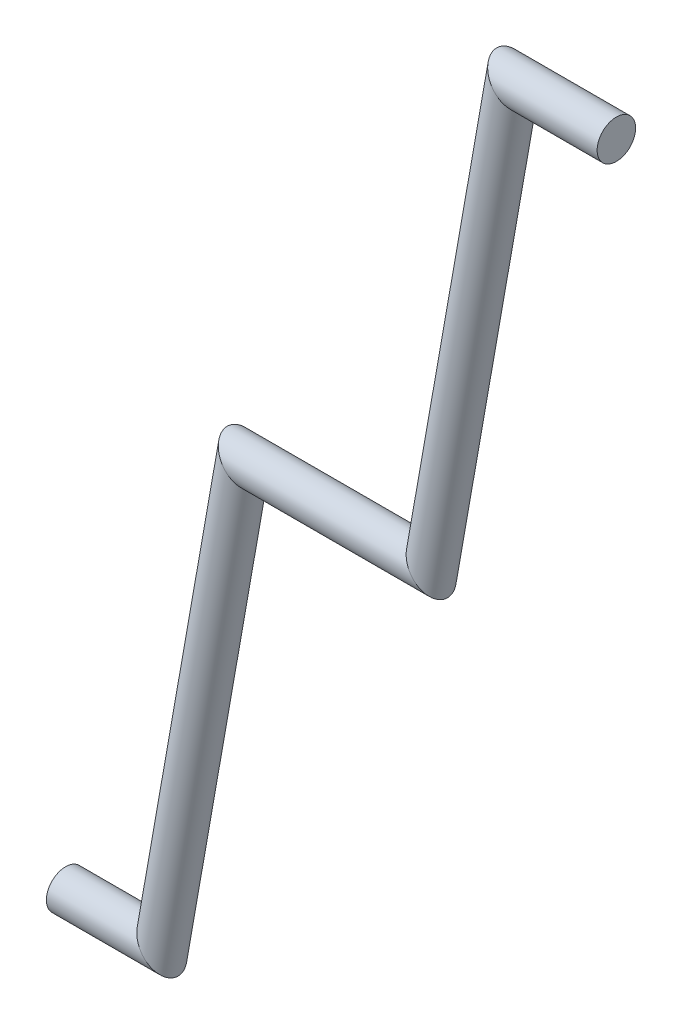
ISO-10303-21;
HEADER;
FILE_DESCRIPTION(('STEP AP214'),'2;1');
FILE_NAME('part.step','',(''),(''),'','','');
FILE_SCHEMA(('AUTOMOTIVE_DESIGN { 1 0 10303 214 1 1 1 1 }'));
ENDSEC;
DATA;
#1=APPLICATION_CONTEXT('core data for automotive mechanical design processes');
#2=APPLICATION_PROTOCOL_DEFINITION('international standard','automotive_design',2000,#1);
#3=PRODUCT_CONTEXT('',#1,'mechanical');
#4=PRODUCT('Part','Part','',(#3));
#5=PRODUCT_RELATED_PRODUCT_CATEGORY('part','',(#4));
#6=PRODUCT_DEFINITION_FORMATION('','',#4);
#7=PRODUCT_DEFINITION_CONTEXT('part definition',#1,'design');
#8=PRODUCT_DEFINITION('design','',#6,#7);
#9=PRODUCT_DEFINITION_SHAPE('','',#8);
#10=(LENGTH_UNIT() NAMED_UNIT(*) SI_UNIT(.MILLI.,.METRE.));
#11=(NAMED_UNIT(*) PLANE_ANGLE_UNIT() SI_UNIT($,.RADIAN.));
#12=(NAMED_UNIT(*) SI_UNIT($,.STERADIAN.) SOLID_ANGLE_UNIT());
#13=UNCERTAINTY_MEASURE_WITH_UNIT(LENGTH_MEASURE(1.E-05),#10,'distance_accuracy_value','');
#14=(GEOMETRIC_REPRESENTATION_CONTEXT(3) GLOBAL_UNCERTAINTY_ASSIGNED_CONTEXT((#13)) GLOBAL_UNIT_ASSIGNED_CONTEXT((#10,
#11,#12)) REPRESENTATION_CONTEXT('',''));
#15=CARTESIAN_POINT('',(0.,0.,0.));
#16=DIRECTION('',(0.,0.,1.));
#17=DIRECTION('',(1.,0.,0.));
#18=AXIS2_PLACEMENT_3D('',#15,#16,#17);
#19=CARTESIAN_POINT('',(147.421240327859,304.8,0.));
#20=DIRECTION('',(1.,0.,0.));
#21=DIRECTION('',(0.,1.,0.));
#22=AXIS2_PLACEMENT_3D('',#19,#20,#21);
#23=CYLINDRICAL_SURFACE('',#22,6.35);
#24=CARTESIAN_POINT('',(147.421240327859,304.8,0.));
#25=DIRECTION('',(0.766044443118977,0.64278760968654,0.));
#26=DIRECTION('',(-0.64278760968654,0.766044443118977,0.));
#27=AXIS2_PLACEMENT_3D('',#24,#25,#26);
#28=ELLIPSE('',#27,8.28933628725999,6.35);
#29=CARTESIAN_POINT('',(142.092957669884,311.15,0.));
#30=VERTEX_POINT('',#29);
#31=EDGE_CURVE('E42',#30,#30,#28,.T.);
#32=ORIENTED_EDGE('',*,*,#31,.T.);
#33=EDGE_LOOP('',(#32));
#34=FACE_BOUND('',#33,.T.);
#35=CARTESIAN_POINT('',(181.551345013433,304.8,0.));
#36=DIRECTION('',(1.,0.,0.));
#37=DIRECTION('',(0.,1.,0.));
#38=AXIS2_PLACEMENT_3D('',#35,#36,#37);
#39=CIRCLE('',#38,6.35);
#40=CARTESIAN_POINT('',(181.551345013433,311.15,0.));
#41=VERTEX_POINT('',#40);
#42=EDGE_CURVE('E11',#41,#41,#39,.F.);
#43=ORIENTED_EDGE('',*,*,#42,.T.);
#44=EDGE_LOOP('',(#43));
#45=FACE_BOUND('',#44,.T.);
#46=ADVANCED_FACE('F36',(#34,#45),#23,.T.);
#47=CARTESIAN_POINT('',(120.54900846789,152.4,0.));
#48=DIRECTION('',(0.173648177666927,0.984807753012209,0.));
#49=DIRECTION('',(-0.984807753012209,0.173648177666927,0.));
#50=AXIS2_PLACEMENT_3D('',#47,#48,#49);
#51=CYLINDRICAL_SURFACE('',#50,6.35);
#52=CARTESIAN_POINT('',(120.54900846789,152.4,0.));
#53=DIRECTION('',(0.766044443118977,0.642787609686541,0.));
#54=DIRECTION('',(0.642787609686541,-0.766044443118977,0.));
#55=AXIS2_PLACEMENT_3D('',#52,#53,#54);
#56=ELLIPSE('',#55,8.28933628725998,6.35);
#57=CARTESIAN_POINT('',(125.877291125866,146.05,0.));
#58=VERTEX_POINT('',#57);
#59=EDGE_CURVE('E46',#58,#58,#56,.F.);
#60=ORIENTED_EDGE('',*,*,#59,.F.);
#61=EDGE_LOOP('',(#60));
#62=FACE_BOUND('',#61,.T.);
#63=ORIENTED_EDGE('',*,*,#31,.F.);
#64=EDGE_LOOP('',(#63));
#65=FACE_BOUND('',#64,.T.);
#66=ADVANCED_FACE('F78',(#62,#65),#51,.T.);
#67=CARTESIAN_POINT('',(58.6222318599695,152.4,0.));
#68=DIRECTION('',(1.,0.,0.));
#69=DIRECTION('',(0.,1.,0.));
#70=AXIS2_PLACEMENT_3D('',#67,#68,#69);
#71=CYLINDRICAL_SURFACE('',#70,6.35);
#72=CARTESIAN_POINT('',(58.6222318599695,152.4,0.));
#73=DIRECTION('',(0.766044443118976,0.642787609686541,0.));
#74=DIRECTION('',(-0.642787609686541,0.766044443118976,0.));
#75=AXIS2_PLACEMENT_3D('',#72,#73,#74);
#76=ELLIPSE('',#75,8.28933628725998,6.35);
#77=CARTESIAN_POINT('',(53.2939492019937,158.75,0.));
#78=VERTEX_POINT('',#77);
#79=EDGE_CURVE('E50',#78,#78,#76,.F.);
#80=ORIENTED_EDGE('',*,*,#79,.F.);
#81=EDGE_LOOP('',(#80));
#82=FACE_BOUND('',#81,.T.);
#83=ORIENTED_EDGE('',*,*,#59,.T.);
#84=EDGE_LOOP('',(#83));
#85=FACE_BOUND('',#84,.T.);
#86=ADVANCED_FACE('F82',(#82,#85),#71,.T.);
#87=CARTESIAN_POINT('',(31.75,0.,0.));
#88=DIRECTION('',(0.173648177666927,0.984807753012209,0.));
#89=DIRECTION('',(-0.984807753012209,0.173648177666927,0.));
#90=AXIS2_PLACEMENT_3D('',#87,#88,#89);
#91=CYLINDRICAL_SURFACE('',#90,6.35);
#92=CARTESIAN_POINT('',(31.75,0.,0.));
#93=DIRECTION('',(0.766044443118977,0.642787609686541,0.));
#94=DIRECTION('',(-0.642787609686541,0.766044443118977,0.));
#95=AXIS2_PLACEMENT_3D('',#92,#93,#94);
#96=ELLIPSE('',#95,8.28933628725998,6.35);
#97=CARTESIAN_POINT('',(26.4217173420243,6.35,0.));
#98=VERTEX_POINT('',#97);
#99=EDGE_CURVE('E55',#98,#98,#96,.T.);
#100=ORIENTED_EDGE('',*,*,#99,.T.);
#101=EDGE_LOOP('',(#100));
#102=FACE_BOUND('',#101,.T.);
#103=ORIENTED_EDGE('',*,*,#79,.T.);
#104=EDGE_LOOP('',(#103));
#105=FACE_BOUND('',#104,.T.);
#106=ADVANCED_FACE('F75',(#102,#105),#91,.T.);
#107=CARTESIAN_POINT('',(49.7105122421383,0.,0.));
#108=DIRECTION('',(-1.,0.,0.));
#109=DIRECTION('',(0.,0.,1.));
#110=AXIS2_PLACEMENT_3D('',#107,#108,#109);
#111=CYLINDRICAL_SURFACE('',#110,6.35);
#112=CARTESIAN_POINT('',(0.,0.,0.));
#113=DIRECTION('',(1.,0.,0.));
#114=DIRECTION('',(0.,0.,-1.));
#115=AXIS2_PLACEMENT_3D('',#112,#113,#114);
#116=CIRCLE('',#115,6.35);
#117=CARTESIAN_POINT('',(0.,0.,-6.35));
#118=VERTEX_POINT('',#117);
#119=EDGE_CURVE('E58',#118,#118,#116,.T.);
#120=ORIENTED_EDGE('',*,*,#119,.T.);
#121=EDGE_LOOP('',(#120));
#122=FACE_BOUND('',#121,.T.);
#123=ORIENTED_EDGE('',*,*,#99,.F.);
#124=EDGE_LOOP('',(#123));
#125=FACE_BOUND('',#124,.T.);
#126=ADVANCED_FACE('F62',(#122,#125),#111,.T.);
#127=CARTESIAN_POINT('',(0.,0.,0.));
#128=DIRECTION('',(1.,0.,0.));
#129=DIRECTION('',(0.,0.,-1.));
#130=AXIS2_PLACEMENT_3D('',#127,#128,#129);
#131=PLANE('',#130);
#132=ORIENTED_EDGE('',*,*,#119,.F.);
#133=EDGE_LOOP('',(#132));
#134=FACE_BOUND('',#133,.T.);
#135=ADVANCED_FACE('F65',(#134),#131,.F.);
#136=CARTESIAN_POINT('',(181.551345013433,304.8,0.));
#137=DIRECTION('',(1.,0.,0.));
#138=DIRECTION('',(0.,1.,0.));
#139=AXIS2_PLACEMENT_3D('',#136,#137,#138);
#140=PLANE('',#139);
#141=ORIENTED_EDGE('',*,*,#42,.F.);
#142=EDGE_LOOP('',(#141));
#143=FACE_BOUND('',#142,.T.);
#144=ADVANCED_FACE('F67',(#143),#140,.T.);
#145=CLOSED_SHELL('',(#46,#66,#86,#106,#126,#135,#144));
#146=MANIFOLD_SOLID_BREP('B2',#145);
#147=ADVANCED_BREP_SHAPE_REPRESENTATION('',(#18,#146),#14);
#148=SHAPE_DEFINITION_REPRESENTATION(#9,#147);
ENDSEC;
END-ISO-10303-21;
